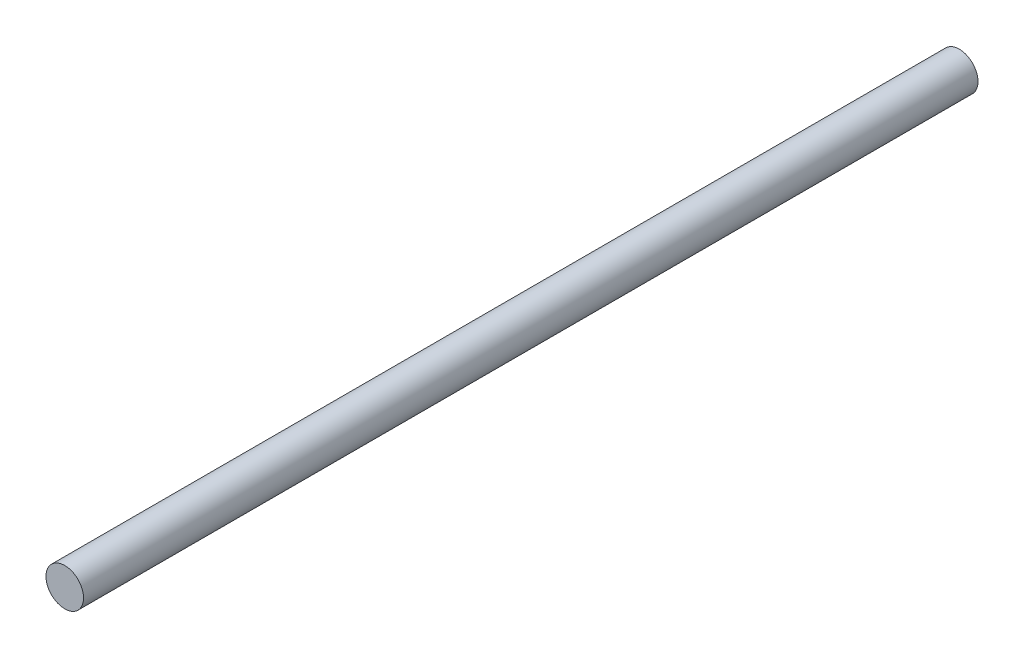
ISO-10303-21;
HEADER;
FILE_DESCRIPTION(('STEP AP214'),'2;1');
FILE_NAME('part.step','',(''),(''),'','','');
FILE_SCHEMA(('AUTOMOTIVE_DESIGN { 1 0 10303 214 1 1 1 1 }'));
ENDSEC;
DATA;
#1=APPLICATION_CONTEXT('core data for automotive mechanical design processes');
#2=APPLICATION_PROTOCOL_DEFINITION('international standard','automotive_design',2000,#1);
#3=PRODUCT_CONTEXT('',#1,'mechanical');
#4=PRODUCT('Part','Part','',(#3));
#5=PRODUCT_RELATED_PRODUCT_CATEGORY('part','',(#4));
#6=PRODUCT_DEFINITION_FORMATION('','',#4);
#7=PRODUCT_DEFINITION_CONTEXT('part definition',#1,'design');
#8=PRODUCT_DEFINITION('design','',#6,#7);
#9=PRODUCT_DEFINITION_SHAPE('','',#8);
#10=(LENGTH_UNIT() NAMED_UNIT(*) SI_UNIT(.MILLI.,.METRE.));
#11=(NAMED_UNIT(*) PLANE_ANGLE_UNIT() SI_UNIT($,.RADIAN.));
#12=(NAMED_UNIT(*) SI_UNIT($,.STERADIAN.) SOLID_ANGLE_UNIT());
#13=UNCERTAINTY_MEASURE_WITH_UNIT(LENGTH_MEASURE(1.E-05),#10,'distance_accuracy_value','');
#14=(GEOMETRIC_REPRESENTATION_CONTEXT(3) GLOBAL_UNCERTAINTY_ASSIGNED_CONTEXT((#13)) GLOBAL_UNIT_ASSIGNED_CONTEXT((#10,
#11,#12)) REPRESENTATION_CONTEXT('',''));
#15=CARTESIAN_POINT('',(0.,0.,0.));
#16=DIRECTION('',(0.,0.,1.));
#17=DIRECTION('',(1.,0.,0.));
#18=AXIS2_PLACEMENT_3D('',#15,#16,#17);
#19=CARTESIAN_POINT('',(0.,0.,59.5));
#20=DIRECTION('',(0.,0.,-1.));
#21=DIRECTION('',(-1.,0.,0.));
#22=AXIS2_PLACEMENT_3D('',#19,#20,#21);
#23=CYLINDRICAL_SURFACE('',#22,1.25);
#24=CARTESIAN_POINT('',(0.,0.,59.5));
#25=DIRECTION('',(0.,0.,1.));
#26=DIRECTION('',(1.,0.,0.));
#27=AXIS2_PLACEMENT_3D('',#24,#25,#26);
#28=CIRCLE('',#27,1.25);
#29=CARTESIAN_POINT('',(1.25,0.,59.5));
#30=VERTEX_POINT('',#29);
#31=EDGE_CURVE('E10',#30,#30,#28,.T.);
#32=ORIENTED_EDGE('',*,*,#31,.F.);
#33=EDGE_LOOP('',(#32));
#34=FACE_BOUND('',#33,.T.);
#35=CARTESIAN_POINT('',(0.,0.,0.));
#36=DIRECTION('',(0.,0.,1.));
#37=DIRECTION('',(1.,0.,0.));
#38=AXIS2_PLACEMENT_3D('',#35,#36,#37);
#39=CIRCLE('',#38,1.25);
#40=CARTESIAN_POINT('',(1.25,0.,0.));
#41=VERTEX_POINT('',#40);
#42=EDGE_CURVE('E33',#41,#41,#39,.T.);
#43=ORIENTED_EDGE('',*,*,#42,.T.);
#44=EDGE_LOOP('',(#43));
#45=FACE_BOUND('',#44,.T.);
#46=ADVANCED_FACE('F30',(#34,#45),#23,.T.);
#47=CARTESIAN_POINT('',(0.,0.,59.5));
#48=DIRECTION('',(0.,0.,1.));
#49=DIRECTION('',(1.,0.,0.));
#50=AXIS2_PLACEMENT_3D('',#47,#48,#49);
#51=PLANE('',#50);
#52=ORIENTED_EDGE('',*,*,#31,.T.);
#53=EDGE_LOOP('',(#52));
#54=FACE_BOUND('',#53,.T.);
#55=ADVANCED_FACE('F45',(#54),#51,.T.);
#56=CARTESIAN_POINT('',(0.,0.,0.));
#57=DIRECTION('',(0.,0.,1.));
#58=DIRECTION('',(1.,0.,0.));
#59=AXIS2_PLACEMENT_3D('',#56,#57,#58);
#60=PLANE('',#59);
#61=ORIENTED_EDGE('',*,*,#42,.F.);
#62=EDGE_LOOP('',(#61));
#63=FACE_BOUND('',#62,.T.);
#64=ADVANCED_FACE('F43',(#63),#60,.F.);
#65=CLOSED_SHELL('',(#46,#55,#64));
#66=MANIFOLD_SOLID_BREP('B2',#65);
#67=ADVANCED_BREP_SHAPE_REPRESENTATION('',(#18,#66),#14);
#68=SHAPE_DEFINITION_REPRESENTATION(#9,#67);
ENDSEC;
END-ISO-10303-21;
